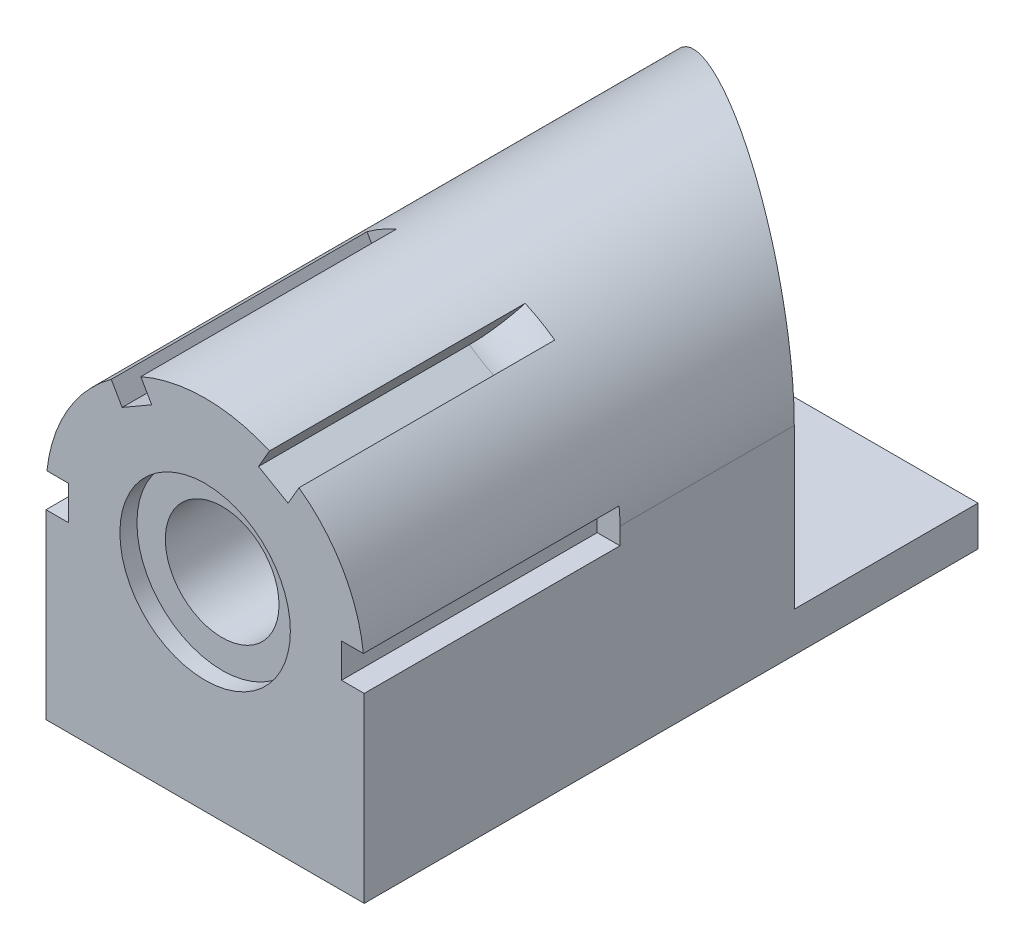
ISO-10303-21;
HEADER;
FILE_DESCRIPTION(('STEP AP214'),'2;1');
FILE_NAME('part.step','',(''),(''),'','','');
FILE_SCHEMA(('AUTOMOTIVE_DESIGN { 1 0 10303 214 1 1 1 1 }'));
ENDSEC;
DATA;
#1=APPLICATION_CONTEXT('core data for automotive mechanical design processes');
#2=APPLICATION_PROTOCOL_DEFINITION('international standard','automotive_design',2000,#1);
#3=PRODUCT_CONTEXT('',#1,'mechanical');
#4=PRODUCT('Part','Part','',(#3));
#5=PRODUCT_RELATED_PRODUCT_CATEGORY('part','',(#4));
#6=PRODUCT_DEFINITION_FORMATION('','',#4);
#7=PRODUCT_DEFINITION_CONTEXT('part definition',#1,'design');
#8=PRODUCT_DEFINITION('design','',#6,#7);
#9=PRODUCT_DEFINITION_SHAPE('','',#8);
#10=(LENGTH_UNIT() NAMED_UNIT(*) SI_UNIT(.MILLI.,.METRE.));
#11=(NAMED_UNIT(*) PLANE_ANGLE_UNIT() SI_UNIT($,.RADIAN.));
#12=(NAMED_UNIT(*) SI_UNIT($,.STERADIAN.) SOLID_ANGLE_UNIT());
#13=UNCERTAINTY_MEASURE_WITH_UNIT(LENGTH_MEASURE(1.E-05),#10,'distance_accuracy_value','');
#14=(GEOMETRIC_REPRESENTATION_CONTEXT(3) GLOBAL_UNCERTAINTY_ASSIGNED_CONTEXT((#13)) GLOBAL_UNIT_ASSIGNED_CONTEXT((#10,
#11,#12)) REPRESENTATION_CONTEXT('',''));
#15=CARTESIAN_POINT('',(0.,0.,0.));
#16=DIRECTION('',(0.,0.,1.));
#17=DIRECTION('',(1.,0.,0.));
#18=AXIS2_PLACEMENT_3D('',#15,#16,#17);
#19=CARTESIAN_POINT('',(0.,35.,-108.));
#20=DIRECTION('',(0.,0.,1.));
#21=DIRECTION('',(1.,0.,0.));
#22=AXIS2_PLACEMENT_3D('',#19,#20,#21);
#23=CYLINDRICAL_SURFACE('',#22,10.);
#24=CARTESIAN_POINT('',(0.,35.,-91.8341924626907));
#25=DIRECTION('',(0.499999999999995,0.,-0.866025403784442));
#26=DIRECTION('',(0.866025403784442,0.,0.499999999999995));
#27=AXIS2_PLACEMENT_3D('',#24,#25,#26);
#28=ELLIPSE('',#27,11.5470053837925,10.);
#29=CARTESIAN_POINT('',(10.,35.,-86.0606897707945));
#30=VERTEX_POINT('',#29);
#31=EDGE_CURVE('E351',#30,#30,#28,.F.);
#32=ORIENTED_EDGE('',*,*,#31,.F.);
#33=EDGE_LOOP('',(#32));
#34=FACE_BOUND('',#33,.T.);
#35=CARTESIAN_POINT('',(0.,35.,-3.));
#36=DIRECTION('',(0.,0.,1.));
#37=DIRECTION('',(1.,0.,0.));
#38=AXIS2_PLACEMENT_3D('',#35,#36,#37);
#39=CIRCLE('',#38,10.);
#40=CARTESIAN_POINT('',(10.,35.,-3.));
#41=VERTEX_POINT('',#40);
#42=EDGE_CURVE('E325',#41,#41,#39,.T.);
#43=ORIENTED_EDGE('',*,*,#42,.T.);
#44=EDGE_LOOP('',(#43));
#45=FACE_BOUND('',#44,.T.);
#46=ADVANCED_FACE('F41',(#34,#45),#23,.F.);
#47=CARTESIAN_POINT('',(28.,35.,-108.));
#48=DIRECTION('',(1.,0.,0.));
#49=DIRECTION('',(0.,1.,0.));
#50=AXIS2_PLACEMENT_3D('',#47,#48,#49);
#51=PLANE('',#50);
#52=DIRECTION('',(0.,0.,-1.));
#53=VECTOR('',#52,1.);
#54=CARTESIAN_POINT('',(28.,32.,-108.));
#55=LINE('',#54,#53);
#56=CARTESIAN_POINT('',(28.,32.,0.));
#57=VERTEX_POINT('',#56);
#58=CARTESIAN_POINT('',(28.,32.,-45.));
#59=VERTEX_POINT('',#58);
#60=EDGE_CURVE('E230',#57,#59,#55,.T.);
#61=ORIENTED_EDGE('',*,*,#60,.F.);
#62=DIRECTION('',(0.,1.,0.));
#63=VECTOR('',#62,1.);
#64=CARTESIAN_POINT('',(28.,35.,0.));
#65=LINE('',#64,#63);
#66=CARTESIAN_POINT('',(28.,0.,0.));
#67=VERTEX_POINT('',#66);
#68=EDGE_CURVE('E355',#67,#57,#65,.T.);
#69=ORIENTED_EDGE('',*,*,#68,.F.);
#70=DIRECTION('',(0.,0.,1.));
#71=VECTOR('',#70,1.);
#72=CARTESIAN_POINT('',(28.,0.,-108.));
#73=LINE('',#72,#71);
#74=CARTESIAN_POINT('',(28.,0.,-108.));
#75=VERTEX_POINT('',#74);
#76=EDGE_CURVE('E385',#75,#67,#73,.T.);
#77=ORIENTED_EDGE('',*,*,#76,.F.);
#78=DIRECTION('',(0.,1.,0.));
#79=VECTOR('',#78,1.);
#80=CARTESIAN_POINT('',(28.,35.,-108.));
#81=LINE('',#80,#79);
#82=CARTESIAN_POINT('',(28.,7.,-108.));
#83=VERTEX_POINT('',#82);
#84=EDGE_CURVE('E356',#75,#83,#81,.T.);
#85=ORIENTED_EDGE('',*,*,#84,.T.);
#86=DIRECTION('',(0.,0.,-1.));
#87=VECTOR('',#86,1.);
#88=CARTESIAN_POINT('',(28.,7.,-108.));
#89=LINE('',#88,#87);
#90=CARTESIAN_POINT('',(28.,7.,-75.6683849253814));
#91=VERTEX_POINT('',#90);
#92=EDGE_CURVE('E345',#91,#83,#89,.T.);
#93=ORIENTED_EDGE('',*,*,#92,.F.);
#94=DIRECTION('',(0.,-1.,0.));
#95=VECTOR('',#94,1.);
#96=CARTESIAN_POINT('',(28.,63.,-75.6683849253814));
#97=LINE('',#96,#95);
#98=CARTESIAN_POINT('',(28.,35.,-75.6683849253814));
#99=VERTEX_POINT('',#98);
#100=EDGE_CURVE('E348',#99,#91,#97,.T.);
#101=ORIENTED_EDGE('',*,*,#100,.F.);
#102=DIRECTION('',(0.,0.,1.));
#103=VECTOR('',#102,1.);
#104=CARTESIAN_POINT('',(28.,35.,-108.));
#105=LINE('',#104,#103);
#106=CARTESIAN_POINT('',(28.,35.,-45.));
#107=VERTEX_POINT('',#106);
#108=EDGE_CURVE('E370',#99,#107,#105,.T.);
#109=ORIENTED_EDGE('',*,*,#108,.T.);
#110=DIRECTION('',(0.,-1.,0.));
#111=VECTOR('',#110,1.);
#112=CARTESIAN_POINT('',(28.,35.,-45.));
#113=LINE('',#112,#111);
#114=EDGE_CURVE('E285',#107,#59,#113,.T.);
#115=ORIENTED_EDGE('',*,*,#114,.T.);
#116=EDGE_LOOP('',(#61,#69,#77,#85,#93,#101,#109,#115));
#117=FACE_BOUND('',#116,.T.);
#118=ADVANCED_FACE('F510',(#117),#51,.T.);
#119=CARTESIAN_POINT('',(0.,35.,-108.));
#120=DIRECTION('',(0.,0.,1.));
#121=DIRECTION('',(1.,0.,0.));
#122=AXIS2_PLACEMENT_3D('',#119,#120,#121);
#123=CYLINDRICAL_SURFACE('',#122,28.);
#124=DIRECTION('',(0.,0.,1.));
#125=VECTOR('',#124,1.);
#126=CARTESIAN_POINT('',(-16.5174871184283,57.6091269024824,-108.));
#127=LINE('',#126,#125);
#128=CARTESIAN_POINT('',(-16.5174871184283,57.6091269024824,-45.));
#129=VERTEX_POINT('',#128);
#130=CARTESIAN_POINT('',(-16.5174871184283,57.6091269024824,0.));
#131=VERTEX_POINT('',#130);
#132=EDGE_CURVE('E282',#129,#131,#127,.T.);
#133=ORIENTED_EDGE('',*,*,#132,.F.);
#134=CARTESIAN_POINT('',(0.,35.,-45.));
#135=DIRECTION('',(0.,0.,1.));
#136=DIRECTION('',(1.,0.,0.));
#137=AXIS2_PLACEMENT_3D('',#134,#135,#136);
#138=CIRCLE('',#137,28.);
#139=CARTESIAN_POINT('',(-11.3213346957217,60.6091269024824,-45.));
#140=VERTEX_POINT('',#139);
#141=EDGE_CURVE('E427',#129,#140,#138,.F.);
#142=ORIENTED_EDGE('',*,*,#141,.T.);
#143=DIRECTION('',(0.,0.,1.));
#144=VECTOR('',#143,1.);
#145=CARTESIAN_POINT('',(-11.3213346957217,60.6091269024824,-108.));
#146=LINE('',#145,#144);
#147=CARTESIAN_POINT('',(-11.3213346957217,60.6091269024824,0.));
#148=VERTEX_POINT('',#147);
#149=EDGE_CURVE('E210',#148,#140,#146,.F.);
#150=ORIENTED_EDGE('',*,*,#149,.F.);
#151=CARTESIAN_POINT('',(0.,35.,0.));
#152=DIRECTION('',(0.,0.,1.));
#153=DIRECTION('',(1.,0.,0.));
#154=AXIS2_PLACEMENT_3D('',#151,#152,#153);
#155=CIRCLE('',#154,28.);
#156=CARTESIAN_POINT('',(11.3213346957219,60.6091269024823,0.));
#157=VERTEX_POINT('',#156);
#158=EDGE_CURVE('E377',#157,#148,#155,.T.);
#159=ORIENTED_EDGE('',*,*,#158,.F.);
#160=DIRECTION('',(0.,0.,1.));
#161=VECTOR('',#160,1.);
#162=CARTESIAN_POINT('',(11.3213346957219,60.6091269024823,-108.));
#163=LINE('',#162,#161);
#164=CARTESIAN_POINT('',(11.3213346957219,60.6091269024823,-45.));
#165=VERTEX_POINT('',#164);
#166=EDGE_CURVE('E277',#165,#157,#163,.T.);
#167=ORIENTED_EDGE('',*,*,#166,.F.);
#168=CARTESIAN_POINT('',(0.,35.,-45.));
#169=DIRECTION('',(0.,0.,1.));
#170=DIRECTION('',(1.,0.,0.));
#171=AXIS2_PLACEMENT_3D('',#168,#169,#170);
#172=CIRCLE('',#171,28.);
#173=CARTESIAN_POINT('',(16.5174871184285,57.6091269024823,-45.));
#174=VERTEX_POINT('',#173);
#175=EDGE_CURVE('E423',#165,#174,#172,.F.);
#176=ORIENTED_EDGE('',*,*,#175,.T.);
#177=DIRECTION('',(0.,0.,1.));
#178=VECTOR('',#177,1.);
#179=CARTESIAN_POINT('',(16.5174871184285,57.6091269024823,-108.));
#180=LINE('',#179,#178);
#181=CARTESIAN_POINT('',(16.5174871184285,57.6091269024823,0.));
#182=VERTEX_POINT('',#181);
#183=EDGE_CURVE('E274',#182,#174,#180,.F.);
#184=ORIENTED_EDGE('',*,*,#183,.F.);
#185=CARTESIAN_POINT('',(27.8388218141501,38.,0.));
#186=VERTEX_POINT('',#185);
#187=EDGE_CURVE('E378',#186,#182,#155,.T.);
#188=ORIENTED_EDGE('',*,*,#187,.F.);
#189=DIRECTION('',(0.,0.,1.));
#190=VECTOR('',#189,1.);
#191=CARTESIAN_POINT('',(27.8388218141501,38.,-108.));
#192=LINE('',#191,#190);
#193=CARTESIAN_POINT('',(27.8388218141501,38.,-45.));
#194=VERTEX_POINT('',#193);
#195=EDGE_CURVE('E271',#194,#186,#192,.T.);
#196=ORIENTED_EDGE('',*,*,#195,.F.);
#197=CARTESIAN_POINT('',(0.,35.,-45.));
#198=DIRECTION('',(0.,0.,1.));
#199=DIRECTION('',(1.,0.,0.));
#200=AXIS2_PLACEMENT_3D('',#197,#198,#199);
#201=CIRCLE('',#200,28.);
#202=EDGE_CURVE('E419',#194,#107,#201,.F.);
#203=ORIENTED_EDGE('',*,*,#202,.T.);
#204=ORIENTED_EDGE('',*,*,#108,.F.);
#205=CARTESIAN_POINT('',(0.,35.,-91.8341924626907));
#206=DIRECTION('',(0.499999999999995,0.,-0.866025403784442));
#207=DIRECTION('',(0.866025403784442,0.,0.499999999999995));
#208=AXIS2_PLACEMENT_3D('',#205,#206,#207);
#209=ELLIPSE('',#208,32.3316150746189,28.);
#210=CARTESIAN_POINT('',(-28.,35.,-108.));
#211=VERTEX_POINT('',#210);
#212=EDGE_CURVE('E352',#99,#211,#209,.F.);
#213=ORIENTED_EDGE('',*,*,#212,.T.);
#214=DIRECTION('',(0.,0.,1.));
#215=VECTOR('',#214,1.);
#216=CARTESIAN_POINT('',(-28.,35.,-108.));
#217=LINE('',#216,#215);
#218=CARTESIAN_POINT('',(-28.,35.,-45.));
#219=VERTEX_POINT('',#218);
#220=EDGE_CURVE('E393',#211,#219,#217,.T.);
#221=ORIENTED_EDGE('',*,*,#220,.T.);
#222=CARTESIAN_POINT('',(0.,35.,-45.));
#223=DIRECTION('',(0.,0.,1.));
#224=DIRECTION('',(1.,0.,0.));
#225=AXIS2_PLACEMENT_3D('',#222,#223,#224);
#226=CIRCLE('',#225,28.);
#227=CARTESIAN_POINT('',(-27.8388218141501,38.,-45.));
#228=VERTEX_POINT('',#227);
#229=EDGE_CURVE('E321',#219,#228,#226,.F.);
#230=ORIENTED_EDGE('',*,*,#229,.T.);
#231=DIRECTION('',(0.,0.,1.));
#232=VECTOR('',#231,1.);
#233=CARTESIAN_POINT('',(-27.8388218141501,38.,-108.));
#234=LINE('',#233,#232);
#235=CARTESIAN_POINT('',(-27.8388218141501,38.,0.));
#236=VERTEX_POINT('',#235);
#237=EDGE_CURVE('E312',#236,#228,#234,.F.);
#238=ORIENTED_EDGE('',*,*,#237,.F.);
#239=EDGE_CURVE('E374',#131,#236,#155,.T.);
#240=ORIENTED_EDGE('',*,*,#239,.F.);
#241=EDGE_LOOP('',(#133,#142,#150,#159,#167,#176,#184,#188,#196,#203,#204,#213,#221,#230,#238,#240));
#242=FACE_BOUND('',#241,.T.);
#243=ADVANCED_FACE('F516',(#242),#123,.T.);
#244=CARTESIAN_POINT('',(0.,35.,-108.));
#245=DIRECTION('',(0.,0.,1.));
#246=DIRECTION('',(1.,0.,0.));
#247=AXIS2_PLACEMENT_3D('',#244,#245,#246);
#248=PLANE('',#247);
#249=DIRECTION('',(-1.,0.,0.));
#250=VECTOR('',#249,1.);
#251=CARTESIAN_POINT('',(28.,7.,-108.));
#252=LINE('',#251,#250);
#253=CARTESIAN_POINT('',(-28.,7.,-108.));
#254=VERTEX_POINT('',#253);
#255=EDGE_CURVE('E334',#83,#254,#252,.T.);
#256=ORIENTED_EDGE('',*,*,#255,.F.);
#257=ORIENTED_EDGE('',*,*,#84,.F.);
#258=DIRECTION('',(1.,0.,0.));
#259=VECTOR('',#258,1.);
#260=CARTESIAN_POINT('',(-28.,0.,-108.));
#261=LINE('',#260,#259);
#262=CARTESIAN_POINT('',(-28.,0.,-108.));
#263=VERTEX_POINT('',#262);
#264=EDGE_CURVE('E366',#263,#75,#261,.T.);
#265=ORIENTED_EDGE('',*,*,#264,.F.);
#266=DIRECTION('',(0.,-1.,0.));
#267=VECTOR('',#266,1.);
#268=CARTESIAN_POINT('',(-28.,35.,-108.));
#269=LINE('',#268,#267);
#270=EDGE_CURVE('E360',#254,#263,#269,.T.);
#271=ORIENTED_EDGE('',*,*,#270,.F.);
#272=EDGE_LOOP('',(#256,#257,#265,#271));
#273=FACE_BOUND('',#272,.T.);
#274=ADVANCED_FACE('F512',(#273),#248,.F.);
#275=CARTESIAN_POINT('',(-28.,0.,-108.));
#276=DIRECTION('',(0.,-1.,0.));
#277=DIRECTION('',(1.,0.,0.));
#278=AXIS2_PLACEMENT_3D('',#275,#276,#277);
#279=PLANE('',#278);
#280=DIRECTION('',(1.,0.,0.));
#281=VECTOR('',#280,1.);
#282=CARTESIAN_POINT('',(-28.,0.,0.));
#283=LINE('',#282,#281);
#284=CARTESIAN_POINT('',(-28.,0.,0.));
#285=VERTEX_POINT('',#284);
#286=EDGE_CURVE('E361',#285,#67,#283,.T.);
#287=ORIENTED_EDGE('',*,*,#286,.F.);
#288=DIRECTION('',(0.,0.,1.));
#289=VECTOR('',#288,1.);
#290=CARTESIAN_POINT('',(-28.,0.,-108.));
#291=LINE('',#290,#289);
#292=EDGE_CURVE('E389',#263,#285,#291,.T.);
#293=ORIENTED_EDGE('',*,*,#292,.F.);
#294=ORIENTED_EDGE('',*,*,#264,.T.);
#295=ORIENTED_EDGE('',*,*,#76,.T.);
#296=EDGE_LOOP('',(#287,#293,#294,#295));
#297=FACE_BOUND('',#296,.T.);
#298=ADVANCED_FACE('F515',(#297),#279,.T.);
#299=CARTESIAN_POINT('',(-28.,35.,-108.));
#300=DIRECTION('',(-1.,0.,0.));
#301=DIRECTION('',(0.,-1.,0.));
#302=AXIS2_PLACEMENT_3D('',#299,#300,#301);
#303=PLANE('',#302);
#304=DIRECTION('',(0.,0.,1.));
#305=VECTOR('',#304,1.);
#306=CARTESIAN_POINT('',(-28.,32.,-108.));
#307=LINE('',#306,#305);
#308=CARTESIAN_POINT('',(-28.,32.,-45.));
#309=VERTEX_POINT('',#308);
#310=CARTESIAN_POINT('',(-28.,32.,0.));
#311=VERTEX_POINT('',#310);
#312=EDGE_CURVE('E318',#309,#311,#307,.T.);
#313=ORIENTED_EDGE('',*,*,#312,.F.);
#314=DIRECTION('',(0.,1.,0.));
#315=VECTOR('',#314,1.);
#316=CARTESIAN_POINT('',(-28.,35.,-45.));
#317=LINE('',#316,#315);
#318=EDGE_CURVE('E405',#309,#219,#317,.T.);
#319=ORIENTED_EDGE('',*,*,#318,.T.);
#320=ORIENTED_EDGE('',*,*,#220,.F.);
#321=EDGE_CURVE('E362',#211,#254,#269,.T.);
#322=ORIENTED_EDGE('',*,*,#321,.T.);
#323=ORIENTED_EDGE('',*,*,#270,.T.);
#324=ORIENTED_EDGE('',*,*,#292,.T.);
#325=DIRECTION('',(0.,-1.,0.));
#326=VECTOR('',#325,1.);
#327=CARTESIAN_POINT('',(-28.,35.,0.));
#328=LINE('',#327,#326);
#329=EDGE_CURVE('E379',#311,#285,#328,.T.);
#330=ORIENTED_EDGE('',*,*,#329,.F.);
#331=EDGE_LOOP('',(#313,#319,#320,#322,#323,#324,#330));
#332=FACE_BOUND('',#331,.T.);
#333=ADVANCED_FACE('F520',(#332),#303,.T.);
#334=CARTESIAN_POINT('',(0.,35.,0.));
#335=DIRECTION('',(0.,0.,1.));
#336=DIRECTION('',(1.,0.,0.));
#337=AXIS2_PLACEMENT_3D('',#334,#335,#336);
#338=PLANE('',#337);
#339=DIRECTION('',(0.499999999999998,-0.86602540378444,0.));
#340=VECTOR('',#339,1.);
#341=CARTESIAN_POINT('',(-2.59807621135332,33.5,0.));
#342=LINE('',#341,#340);
#343=CARTESIAN_POINT('',(-14.5980762113533,54.2846096908266,0.));
#344=VERTEX_POINT('',#343);
#345=EDGE_CURVE('E416',#131,#344,#342,.T.);
#346=ORIENTED_EDGE('',*,*,#345,.F.);
#347=ORIENTED_EDGE('',*,*,#239,.T.);
#348=DIRECTION('',(-1.,0.,0.));
#349=VECTOR('',#348,1.);
#350=CARTESIAN_POINT('',(-28.7272999200964,38.,0.));
#351=LINE('',#350,#349);
#352=CARTESIAN_POINT('',(-24.,38.,0.));
#353=VERTEX_POINT('',#352);
#354=EDGE_CURVE('E295',#353,#236,#351,.T.);
#355=ORIENTED_EDGE('',*,*,#354,.F.);
#356=DIRECTION('',(0.,1.,0.));
#357=VECTOR('',#356,1.);
#358=CARTESIAN_POINT('',(-24.,38.,0.));
#359=LINE('',#358,#357);
#360=CARTESIAN_POINT('',(-24.,32.,0.));
#361=VERTEX_POINT('',#360);
#362=EDGE_CURVE('E289',#361,#353,#359,.T.);
#363=ORIENTED_EDGE('',*,*,#362,.F.);
#364=DIRECTION('',(1.,0.,0.));
#365=VECTOR('',#364,1.);
#366=CARTESIAN_POINT('',(0.,32.,0.));
#367=LINE('',#366,#365);
#368=EDGE_CURVE('E388',#311,#361,#367,.T.);
#369=ORIENTED_EDGE('',*,*,#368,.F.);
#370=ORIENTED_EDGE('',*,*,#329,.T.);
#371=ORIENTED_EDGE('',*,*,#286,.T.);
#372=ORIENTED_EDGE('',*,*,#68,.T.);
#373=DIRECTION('',(1.,0.,0.));
#374=VECTOR('',#373,1.);
#375=CARTESIAN_POINT('',(28.7272999200964,32.,0.));
#376=LINE('',#375,#374);
#377=CARTESIAN_POINT('',(24.,32.,0.));
#378=VERTEX_POINT('',#377);
#379=EDGE_CURVE('E250',#378,#57,#376,.T.);
#380=ORIENTED_EDGE('',*,*,#379,.F.);
#381=DIRECTION('',(0.,-1.,0.));
#382=VECTOR('',#381,1.);
#383=CARTESIAN_POINT('',(24.,32.,0.));
#384=LINE('',#383,#382);
#385=CARTESIAN_POINT('',(24.,38.,0.));
#386=VERTEX_POINT('',#385);
#387=EDGE_CURVE('E258',#386,#378,#384,.T.);
#388=ORIENTED_EDGE('',*,*,#387,.F.);
#389=DIRECTION('',(-1.,0.,0.));
#390=VECTOR('',#389,1.);
#391=CARTESIAN_POINT('',(0.,38.,0.));
#392=LINE('',#391,#390);
#393=EDGE_CURVE('E409',#186,#386,#392,.T.);
#394=ORIENTED_EDGE('',*,*,#393,.F.);
#395=ORIENTED_EDGE('',*,*,#187,.T.);
#396=DIRECTION('',(0.500000000000004,0.866025403784436,0.));
#397=VECTOR('',#396,1.);
#398=CARTESIAN_POINT('',(16.9617261714016,58.3785715129381,0.));
#399=LINE('',#398,#397);
#400=CARTESIAN_POINT('',(14.5980762113534,54.2846096908265,0.));
#401=VERTEX_POINT('',#400);
#402=EDGE_CURVE('E236',#401,#182,#399,.T.);
#403=ORIENTED_EDGE('',*,*,#402,.F.);
#404=DIRECTION('',(0.866025403784436,-0.500000000000004,0.));
#405=VECTOR('',#404,1.);
#406=CARTESIAN_POINT('',(14.5980762113534,54.2846096908265,0.));
#407=LINE('',#406,#405);
#408=CARTESIAN_POINT('',(9.40192378864679,57.2846096908265,0.));
#409=VERTEX_POINT('',#408);
#410=EDGE_CURVE('E232',#409,#401,#407,.T.);
#411=ORIENTED_EDGE('',*,*,#410,.F.);
#412=DIRECTION('',(-0.500000000000004,-0.866025403784436,0.));
#413=VECTOR('',#412,1.);
#414=CARTESIAN_POINT('',(-2.5980762113533,36.5,0.));
#415=LINE('',#414,#413);
#416=EDGE_CURVE('E412',#157,#409,#415,.T.);
#417=ORIENTED_EDGE('',*,*,#416,.F.);
#418=ORIENTED_EDGE('',*,*,#158,.T.);
#419=DIRECTION('',(-0.499999999999998,0.86602540378444,0.));
#420=VECTOR('',#419,1.);
#421=CARTESIAN_POINT('',(-11.7655737486948,61.3785715129382,0.));
#422=LINE('',#421,#420);
#423=CARTESIAN_POINT('',(-9.40192378864663,57.2846096908265,0.));
#424=VERTEX_POINT('',#423);
#425=EDGE_CURVE('E219',#424,#148,#422,.T.);
#426=ORIENTED_EDGE('',*,*,#425,.F.);
#427=DIRECTION('',(0.86602540378444,0.499999999999998,0.));
#428=VECTOR('',#427,1.);
#429=CARTESIAN_POINT('',(-9.40192378864663,57.2846096908265,0.));
#430=LINE('',#429,#428);
#431=EDGE_CURVE('E199',#344,#424,#430,.T.);
#432=ORIENTED_EDGE('',*,*,#431,.F.);
#433=EDGE_LOOP('',(#346,#347,#355,#363,#369,#370,#371,#372,#380,#388,#394,#395,#403,#411,#417,
#418,#426,#432));
#434=FACE_BOUND('',#433,.T.);
#435=CARTESIAN_POINT('',(0.,35.,0.));
#436=DIRECTION('',(0.,0.,1.));
#437=DIRECTION('',(1.,0.,0.));
#438=AXIS2_PLACEMENT_3D('',#435,#436,#437);
#439=CIRCLE('',#438,15.);
#440=CARTESIAN_POINT('',(15.,35.,0.));
#441=VERTEX_POINT('',#440);
#442=EDGE_CURVE('E329',#441,#441,#439,.T.);
#443=ORIENTED_EDGE('',*,*,#442,.F.);
#444=EDGE_LOOP('',(#443));
#445=FACE_BOUND('',#444,.T.);
#446=ADVANCED_FACE('F506',(#434,#445),#338,.T.);
#447=CARTESIAN_POINT('',(-28.,63.,-108.));
#448=DIRECTION('',(0.499999999999995,0.,-0.866025403784442));
#449=DIRECTION('',(-0.866025403784442,0.,-0.499999999999995));
#450=AXIS2_PLACEMENT_3D('',#447,#448,#449);
#451=PLANE('',#450);
#452=ORIENTED_EDGE('',*,*,#100,.T.);
#453=DIRECTION('',(0.866025403784442,0.,0.499999999999995));
#454=VECTOR('',#453,1.);
#455=CARTESIAN_POINT('',(-28.,7.,-108.));
#456=LINE('',#455,#454);
#457=EDGE_CURVE('E341',#254,#91,#456,.T.);
#458=ORIENTED_EDGE('',*,*,#457,.F.);
#459=ORIENTED_EDGE('',*,*,#321,.F.);
#460=ORIENTED_EDGE('',*,*,#212,.F.);
#461=EDGE_LOOP('',(#452,#458,#459,#460));
#462=FACE_BOUND('',#461,.T.);
#463=ORIENTED_EDGE('',*,*,#31,.T.);
#464=EDGE_LOOP('',(#463));
#465=FACE_BOUND('',#464,.T.);
#466=ADVANCED_FACE('F502',(#462,#465),#451,.T.);
#467=CARTESIAN_POINT('',(0.,7.,0.));
#468=DIRECTION('',(0.,1.,0.));
#469=DIRECTION('',(0.,0.,1.));
#470=AXIS2_PLACEMENT_3D('',#467,#468,#469);
#471=PLANE('',#470);
#472=ORIENTED_EDGE('',*,*,#255,.T.);
#473=ORIENTED_EDGE('',*,*,#457,.T.);
#474=ORIENTED_EDGE('',*,*,#92,.T.);
#475=EDGE_LOOP('',(#472,#473,#474));
#476=FACE_BOUND('',#475,.T.);
#477=ADVANCED_FACE('F498',(#476),#471,.T.);
#478=CARTESIAN_POINT('',(0.,35.,-3.));
#479=DIRECTION('',(0.,0.,1.));
#480=DIRECTION('',(1.,0.,0.));
#481=AXIS2_PLACEMENT_3D('',#478,#479,#480);
#482=CYLINDRICAL_SURFACE('',#481,15.);
#483=CARTESIAN_POINT('',(0.,35.,-3.));
#484=DIRECTION('',(0.,0.,1.));
#485=DIRECTION('',(1.,0.,0.));
#486=AXIS2_PLACEMENT_3D('',#483,#484,#485);
#487=CIRCLE('',#486,15.);
#488=CARTESIAN_POINT('',(15.,35.,-3.));
#489=VERTEX_POINT('',#488);
#490=EDGE_CURVE('E330',#489,#489,#487,.T.);
#491=ORIENTED_EDGE('',*,*,#490,.F.);
#492=EDGE_LOOP('',(#491));
#493=FACE_BOUND('',#492,.T.);
#494=ORIENTED_EDGE('',*,*,#442,.T.);
#495=EDGE_LOOP('',(#494));
#496=FACE_BOUND('',#495,.T.);
#497=ADVANCED_FACE('F494',(#493,#496),#482,.F.);
#498=CARTESIAN_POINT('',(0.,35.,-3.));
#499=DIRECTION('',(0.,0.,1.));
#500=DIRECTION('',(1.,0.,0.));
#501=AXIS2_PLACEMENT_3D('',#498,#499,#500);
#502=PLANE('',#501);
#503=ORIENTED_EDGE('',*,*,#42,.F.);
#504=EDGE_LOOP('',(#503));
#505=FACE_BOUND('',#504,.T.);
#506=ORIENTED_EDGE('',*,*,#490,.T.);
#507=EDGE_LOOP('',(#506));
#508=FACE_BOUND('',#507,.T.);
#509=ADVANCED_FACE('F490',(#505,#508),#502,.T.);
#510=CARTESIAN_POINT('',(-24.,38.,-45.));
#511=DIRECTION('',(1.,0.,0.));
#512=DIRECTION('',(0.,0.,-1.));
#513=AXIS2_PLACEMENT_3D('',#510,#511,#512);
#514=PLANE('',#513);
#515=ORIENTED_EDGE('',*,*,#362,.T.);
#516=DIRECTION('',(0.,0.,1.));
#517=VECTOR('',#516,1.);
#518=CARTESIAN_POINT('',(-24.,38.,-45.));
#519=LINE('',#518,#517);
#520=CARTESIAN_POINT('',(-24.,38.,-45.));
#521=VERTEX_POINT('',#520);
#522=EDGE_CURVE('E302',#521,#353,#519,.T.);
#523=ORIENTED_EDGE('',*,*,#522,.F.);
#524=DIRECTION('',(0.,1.,0.));
#525=VECTOR('',#524,1.);
#526=CARTESIAN_POINT('',(-24.,38.,-45.));
#527=LINE('',#526,#525);
#528=CARTESIAN_POINT('',(-24.,32.,-45.));
#529=VERTEX_POINT('',#528);
#530=EDGE_CURVE('E290',#529,#521,#527,.T.);
#531=ORIENTED_EDGE('',*,*,#530,.F.);
#532=DIRECTION('',(0.,0.,1.));
#533=VECTOR('',#532,1.);
#534=CARTESIAN_POINT('',(-24.,32.,-45.));
#535=LINE('',#534,#533);
#536=EDGE_CURVE('E308',#529,#361,#535,.T.);
#537=ORIENTED_EDGE('',*,*,#536,.T.);
#538=EDGE_LOOP('',(#515,#523,#531,#537));
#539=FACE_BOUND('',#538,.T.);
#540=ADVANCED_FACE('F483',(#539),#514,.F.);
#541=CARTESIAN_POINT('',(-28.7272999200964,32.,-45.));
#542=DIRECTION('',(0.,-1.,0.));
#543=DIRECTION('',(0.,0.,-1.));
#544=AXIS2_PLACEMENT_3D('',#541,#542,#543);
#545=PLANE('',#544);
#546=ORIENTED_EDGE('',*,*,#312,.T.);
#547=ORIENTED_EDGE('',*,*,#368,.T.);
#548=ORIENTED_EDGE('',*,*,#536,.F.);
#549=DIRECTION('',(1.,0.,0.));
#550=VECTOR('',#549,1.);
#551=CARTESIAN_POINT('',(-28.7272999200964,32.,-45.));
#552=LINE('',#551,#550);
#553=EDGE_CURVE('E299',#309,#529,#552,.T.);
#554=ORIENTED_EDGE('',*,*,#553,.F.);
#555=EDGE_LOOP('',(#546,#547,#548,#554));
#556=FACE_BOUND('',#555,.T.);
#557=ADVANCED_FACE('F480',(#556),#545,.F.);
#558=CARTESIAN_POINT('',(-28.7272999200964,38.,-45.));
#559=DIRECTION('',(0.,1.,0.));
#560=DIRECTION('',(0.,0.,1.));
#561=AXIS2_PLACEMENT_3D('',#558,#559,#560);
#562=PLANE('',#561);
#563=ORIENTED_EDGE('',*,*,#237,.T.);
#564=DIRECTION('',(-1.,0.,0.));
#565=VECTOR('',#564,1.);
#566=CARTESIAN_POINT('',(-28.7272999200964,38.,-45.));
#567=LINE('',#566,#565);
#568=EDGE_CURVE('E294',#521,#228,#567,.T.);
#569=ORIENTED_EDGE('',*,*,#568,.F.);
#570=ORIENTED_EDGE('',*,*,#522,.T.);
#571=ORIENTED_EDGE('',*,*,#354,.T.);
#572=EDGE_LOOP('',(#563,#569,#570,#571));
#573=FACE_BOUND('',#572,.T.);
#574=ADVANCED_FACE('F478',(#573),#562,.F.);
#575=CARTESIAN_POINT('',(0.,0.,-45.));
#576=DIRECTION('',(0.,0.,1.));
#577=DIRECTION('',(1.,0.,0.));
#578=AXIS2_PLACEMENT_3D('',#575,#576,#577);
#579=PLANE('',#578);
#580=ORIENTED_EDGE('',*,*,#318,.F.);
#581=ORIENTED_EDGE('',*,*,#553,.T.);
#582=ORIENTED_EDGE('',*,*,#530,.T.);
#583=ORIENTED_EDGE('',*,*,#568,.T.);
#584=ORIENTED_EDGE('',*,*,#229,.F.);
#585=EDGE_LOOP('',(#580,#581,#582,#583,#584));
#586=FACE_BOUND('',#585,.T.);
#587=ADVANCED_FACE('F474',(#586),#579,.T.);
#588=CARTESIAN_POINT('',(24.,32.,-45.));
#589=DIRECTION('',(-1.,0.,0.));
#590=DIRECTION('',(0.,0.,1.));
#591=AXIS2_PLACEMENT_3D('',#588,#589,#590);
#592=PLANE('',#591);
#593=ORIENTED_EDGE('',*,*,#387,.T.);
#594=DIRECTION('',(0.,0.,1.));
#595=VECTOR('',#594,1.);
#596=CARTESIAN_POINT('',(24.,32.,-45.));
#597=LINE('',#596,#595);
#598=CARTESIAN_POINT('',(24.,32.,-45.));
#599=VERTEX_POINT('',#598);
#600=EDGE_CURVE('E257',#599,#378,#597,.T.);
#601=ORIENTED_EDGE('',*,*,#600,.F.);
#602=DIRECTION('',(0.,-1.,0.));
#603=VECTOR('',#602,1.);
#604=CARTESIAN_POINT('',(24.,32.,-45.));
#605=LINE('',#604,#603);
#606=CARTESIAN_POINT('',(24.,38.,-45.));
#607=VERTEX_POINT('',#606);
#608=EDGE_CURVE('E245',#607,#599,#605,.T.);
#609=ORIENTED_EDGE('',*,*,#608,.F.);
#610=DIRECTION('',(0.,0.,1.));
#611=VECTOR('',#610,1.);
#612=CARTESIAN_POINT('',(24.,38.,-45.));
#613=LINE('',#612,#611);
#614=EDGE_CURVE('E237',#607,#386,#613,.T.);
#615=ORIENTED_EDGE('',*,*,#614,.T.);
#616=EDGE_LOOP('',(#593,#601,#609,#615));
#617=FACE_BOUND('',#616,.T.);
#618=ADVANCED_FACE('F467',(#617),#592,.F.);
#619=CARTESIAN_POINT('',(28.7272999200964,38.,-45.));
#620=DIRECTION('',(0.,1.,0.));
#621=DIRECTION('',(0.,0.,1.));
#622=AXIS2_PLACEMENT_3D('',#619,#620,#621);
#623=PLANE('',#622);
#624=ORIENTED_EDGE('',*,*,#195,.T.);
#625=ORIENTED_EDGE('',*,*,#393,.T.);
#626=ORIENTED_EDGE('',*,*,#614,.F.);
#627=DIRECTION('',(-1.,0.,0.));
#628=VECTOR('',#627,1.);
#629=CARTESIAN_POINT('',(28.7272999200964,38.,-45.));
#630=LINE('',#629,#628);
#631=EDGE_CURVE('E254',#194,#607,#630,.T.);
#632=ORIENTED_EDGE('',*,*,#631,.F.);
#633=EDGE_LOOP('',(#624,#625,#626,#632));
#634=FACE_BOUND('',#633,.T.);
#635=ADVANCED_FACE('F464',(#634),#623,.F.);
#636=CARTESIAN_POINT('',(28.7272999200964,32.,-45.));
#637=DIRECTION('',(0.,-1.,0.));
#638=DIRECTION('',(0.,0.,-1.));
#639=AXIS2_PLACEMENT_3D('',#636,#637,#638);
#640=PLANE('',#639);
#641=ORIENTED_EDGE('',*,*,#60,.T.);
#642=DIRECTION('',(1.,0.,0.));
#643=VECTOR('',#642,1.);
#644=CARTESIAN_POINT('',(28.7272999200964,32.,-45.));
#645=LINE('',#644,#643);
#646=EDGE_CURVE('E249',#599,#59,#645,.T.);
#647=ORIENTED_EDGE('',*,*,#646,.F.);
#648=ORIENTED_EDGE('',*,*,#600,.T.);
#649=ORIENTED_EDGE('',*,*,#379,.T.);
#650=EDGE_LOOP('',(#641,#647,#648,#649));
#651=FACE_BOUND('',#650,.T.);
#652=ADVANCED_FACE('F462',(#651),#640,.F.);
#653=CARTESIAN_POINT('',(0.,70.,-45.));
#654=DIRECTION('',(0.,0.,1.));
#655=DIRECTION('',(-1.,0.,0.));
#656=AXIS2_PLACEMENT_3D('',#653,#654,#655);
#657=PLANE('',#656);
#658=ORIENTED_EDGE('',*,*,#202,.F.);
#659=ORIENTED_EDGE('',*,*,#631,.T.);
#660=ORIENTED_EDGE('',*,*,#608,.T.);
#661=ORIENTED_EDGE('',*,*,#646,.T.);
#662=ORIENTED_EDGE('',*,*,#114,.F.);
#663=EDGE_LOOP('',(#658,#659,#660,#661,#662));
#664=FACE_BOUND('',#663,.T.);
#665=ADVANCED_FACE('F458',(#664),#657,.T.);
#666=CARTESIAN_POINT('',(14.5980762113534,54.2846096908265,-45.));
#667=DIRECTION('',(-0.500000000000004,-0.866025403784436,0.));
#668=DIRECTION('',(0.866025403784436,-0.500000000000004,0.));
#669=AXIS2_PLACEMENT_3D('',#666,#667,#668);
#670=PLANE('',#669);
#671=DIRECTION('',(0.,0.,1.));
#672=VECTOR('',#671,1.);
#673=CARTESIAN_POINT('',(14.5980762113534,54.2846096908265,-45.));
#674=LINE('',#673,#672);
#675=CARTESIAN_POINT('',(14.5980762113534,54.2846096908265,-37.1007978518009));
#676=VERTEX_POINT('',#675);
#677=EDGE_CURVE('E240',#676,#401,#674,.T.);
#678=ORIENTED_EDGE('',*,*,#677,.F.);
#679=CARTESIAN_POINT('',(18.4873032086477,52.039163436999,-37.6822100282968));
#680=CARTESIAN_POINT('',(17.7248383706243,52.4793727164794,-42.0757500523806));
#681=CARTESIAN_POINT('',(18.8894601998605,55.6685338947368,-45.));
#682=CARTESIAN_POINT('',(18.2191308689501,52.1939928095127,-37.6201887538816));
#683=CARTESIAN_POINT('',(17.4914126140737,52.6141411398597,-42.0647629717188));
#684=CARTESIAN_POINT('',(18.7099488311003,55.8326088925972,-45.));
#685=CARTESIAN_POINT('',(17.9500992496783,52.3493182873197,-37.563274883484));
#686=CARTESIAN_POINT('',(17.2570418504643,52.7494551633198,-42.0556083255458));
#687=CARTESIAN_POINT('',(18.5266639608055,55.9958100086446,-45.));
#688=CARTESIAN_POINT('',(17.41071192567,52.6607337040334,-37.458860672685));
#689=CARTESIAN_POINT('',(16.785935895283,53.0214483133605,-42.0401884328266));
#690=CARTESIAN_POINT('',(18.1529828537854,56.3197132613644,-45.));
#691=CARTESIAN_POINT('',(17.1403564502087,52.8168235105678,-37.4113587574925));
#692=CARTESIAN_POINT('',(16.5492730135314,53.1580856918471,-42.0339334942226));
#693=CARTESIAN_POINT('',(17.9625878130674,56.4804158119386,-45.));
#694=CARTESIAN_POINT('',(16.5989221390976,53.1294207558363,-37.3249942129953));
#695=CARTESIAN_POINT('',(16.0742028176633,53.4323675973154,-42.0235838795964));
#696=CARTESIAN_POINT('',(17.5752735679765,56.7984521083537,-45.));
#697=CARTESIAN_POINT('',(16.3278444182539,53.2859275509368,-37.2861221899495));
#698=CARTESIAN_POINT('',(15.8358788296573,53.5699640159451,-42.0194941054646));
#699=CARTESIAN_POINT('',(17.3783617282715,56.9557893470545,-45.));
#700=CARTESIAN_POINT('',(15.7849162068523,53.5993872999402,-37.2163295884101));
#701=CARTESIAN_POINT('',(15.3575590538251,53.8461220672805,-42.0128813085108));
#702=CARTESIAN_POINT('',(16.9782518049545,57.2666382947211,-45.));
#703=CARTESIAN_POINT('',(15.5130656780423,53.7563402759279,-37.1854094106931));
#704=CARTESIAN_POINT('',(15.1176532248412,53.9846317622245,-42.0103629968655));
#705=CARTESIAN_POINT('',(16.775053405075,57.4201498105167,-45.));
#706=CARTESIAN_POINT('',(14.7023333042336,54.2244168301871,-37.1043467443448));
#707=CARTESIAN_POINT('',(14.4003207934481,54.3987838345878,-42.004423671688));
#708=CARTESIAN_POINT('',(16.16100437431,57.8708919442277,-45.));
#709=CARTESIAN_POINT('',(14.1626221219181,54.5360192265817,-37.0650272637486));
#710=CARTESIAN_POINT('',(13.9221048863406,54.674881917287,-42.0025580078332));
#711=CARTESIAN_POINT('',(15.7416457385721,58.1616672155966,-45.));
#712=CARTESIAN_POINT('',(13.0819348062247,55.1599543392071,-37.0128414417155));
#713=CARTESIAN_POINT('',(12.9621769051384,55.2290965956368,-42.0003390812742));
#714=CARTESIAN_POINT('',(14.8838954703975,58.7219783954621,-45.));
#715=CARTESIAN_POINT('',(12.5409580883922,55.472287392873,-36.9999918607292));
#716=CARTESIAN_POINT('',(12.4812937916954,55.5067345906319,-41.9999913752612));
#717=CARTESIAN_POINT('',(14.4454919582049,58.9915007430469,-45.));
#718=CARTESIAN_POINT('',(11.6373065840227,55.9940108321743,-37.000005457095));
#719=CARTESIAN_POINT('',(11.6773092988178,55.9709152540191,-42.0000057825863));
#720=CARTESIAN_POINT('',(13.7013132743913,59.4211619628501,-45.));
#721=CARTESIAN_POINT('',(11.2746215424109,56.2034071385799,-37.0057907576853));
#722=CARTESIAN_POINT('',(11.354754942781,56.1571420983052,-42.0001717776181));
#723=CARTESIAN_POINT('',(13.3994401278818,59.5880781869509,-45.));
#724=CARTESIAN_POINT('',(10.5495264687975,56.6220409745187,-37.0291139841933));
#725=CARTESIAN_POINT('',(10.7101092580558,56.5293284579132,-42.001024560048));
#726=CARTESIAN_POINT('',(12.7908110813644,59.9101110889837,-45.));
#727=CARTESIAN_POINT('',(10.1871164376854,56.8312785035383,-37.0466519479634));
#728=CARTESIAN_POINT('',(10.3882718007924,56.7151414004996,-42.0017105998945));
#729=CARTESIAN_POINT('',(12.4840551656334,60.0652277289104,-45.));
#730=CARTESIAN_POINT('',(9.46314521174372,57.2492634857213,-37.0939683611294));
#731=CARTESIAN_POINT('',(9.74602760813432,57.0859412580162,-42.0041183827827));
#732=CARTESIAN_POINT('',(11.8674709180243,60.3629705081315,-45.));
#733=CARTESIAN_POINT('',(9.10158360086002,57.4580111790936,-37.1237382533265));
#734=CARTESIAN_POINT('',(9.4258637120519,57.2707879696042,-42.0058368606948));
#735=CARTESIAN_POINT('',(11.5576448815141,60.5056052950207,-45.));
#736=CARTESIAN_POINT('',(8.37945148275755,57.8749343518706,-37.1963814927705));
#737=CARTESIAN_POINT('',(8.78750966122967,57.6393418526847,-42.0111751443036));
#738=CARTESIAN_POINT('',(10.9363943427577,60.7780977633307,-45.));
#739=CARTESIAN_POINT('',(8.01888094332308,58.0831098498749,-37.239254408885));
#740=CARTESIAN_POINT('',(8.46954606790911,57.8229182188808,-42.0147885772574));
#741=CARTESIAN_POINT('',(10.6249698934359,60.9079558649604,-45.));
#742=CARTESIAN_POINT('',(7.29408777626515,58.5015693799826,-37.3400545851047));
#743=CARTESIAN_POINT('',(7.83188073003454,58.1910744733556,-42.0251906885449));
#744=CARTESIAN_POINT('',(9.99783332573056,61.1564274500137,-45.));
#745=CARTESIAN_POINT('',(6.92988637353259,58.7118411578895,-37.3981877655744));
#746=CARTESIAN_POINT('',(7.51241645624492,58.3755172578245,-42.0320109324886));
#747=CARTESIAN_POINT('',(9.68212338048721,61.2748542182678,-45.));
#748=CARTESIAN_POINT('',(6.20379971096132,59.13104748798,-37.5309119440603));
#749=CARTESIAN_POINT('',(6.87732072759753,58.7421899477202,-42.0504451837553));
#750=CARTESIAN_POINT('',(9.05287694500619,61.4982427422551,-45.));
#751=CARTESIAN_POINT('',(5.84191398507769,59.3399823092348,-37.6054995160004));
#752=CARTESIAN_POINT('',(6.56187183220327,58.9243144523917,-42.0620349007277));
#753=CARTESIAN_POINT('',(8.73934001630725,61.60320729386,-45.));
#754=CARTESIAN_POINT('',(5.12053178028043,59.7564725193631,-37.7735353857591));
#755=CARTESIAN_POINT('',(5.93508165935223,59.2861919274126,-42.0919994770555));
#756=CARTESIAN_POINT('',(8.11573102078917,61.8000377453428,-45.));
#757=CARTESIAN_POINT('',(4.76104255481806,59.9640237204546,-37.867025952637));
#758=CARTESIAN_POINT('',(5.62389719581766,59.465854361202,-42.1103530263099));
#759=CARTESIAN_POINT('',(7.80566839251129,61.8918734879915,-45.));
#760=CARTESIAN_POINT('',(4.22522987460572,60.2733753156104,-38.0234372133555));
#761=CARTESIAN_POINT('',(5.16116213000991,59.7330145760096,-42.1447767140154));
#762=CARTESIAN_POINT('',(7.34539208234471,62.0198192187377,-45.));
#763=CARTESIAN_POINT('',(4.04712967192556,60.3762015155705,-38.0782938191643));
#764=CARTESIAN_POINT('',(5.00782647571599,59.8215429572925,-42.1573760683047));
#765=CARTESIAN_POINT('',(7.19271321414805,62.0608466968824,-45.));
#766=CARTESIAN_POINT('',(3.69232536070176,60.5810478801652,-38.1938278444919));
#767=CARTESIAN_POINT('',(4.70292350193172,59.9975787712836,-42.185195277231));
#768=CARTESIAN_POINT('',(6.88929302998474,62.1396800546733,-45.));
#769=CARTESIAN_POINT('',(3.51562145650755,60.6830679268186,-38.2545060995414));
#770=CARTESIAN_POINT('',(4.55136686773616,60.0850800348339,-42.2004077488752));
#771=CARTESIAN_POINT('',(6.73855199566968,62.1774854704103,-45.));
#772=CARTESIAN_POINT('',(3.33974596215574,60.7846096908265,-38.3183043748636));
#773=CARTESIAN_POINT('',(4.40061020302181,60.1721194357888,-42.2171180488799));
#774=CARTESIAN_POINT('',(6.58894729125892,62.2137056203857,-45.));
#775=(BOUNDED_SURFACE() B_SPLINE_SURFACE(3,2,((#679,#680,#681),(#682,#683,#684),(#685,#686,
#687),(#688,#689,#690),(#691,#692,#693),(#694,#695,#696),(#697,#698,#699),(#700,#701,#702),
(#703,#704,#705),(#706,#707,#708),(#709,#710,#711),(#712,#713,#714),(#715,#716,#717),(#718,#719,
#720),(#721,#722,#723),(#724,#725,#726),(#727,#728,#729),(#730,#731,#732),(#733,#734,#735),
(#736,#737,#738),(#739,#740,#741),(#742,#743,#744),(#745,#746,#747),(#748,#749,#750),(#751,#752,
#753),(#754,#755,#756),(#757,#758,#759),(#760,#761,#762),(#763,#764,#765),(#766,#767,#768),
(#769,#770,#771),(#772,#773,#774)),.UNSPECIFIED.,.F.,.F.,.F.) B_SPLINE_SURFACE_WITH_KNOTS((4,2,
2,2,2,2,2,2,2,2,2,2,2,2,2,4),(3,3),(0.,0.947339144273261,1.89451964739801,2.84066402224195,
3.78685607384227,5.65951861509626,7.53336654175226,8.7897158230085,10.0460691506612,
11.3015450524826,12.5569796494729,13.8303134330652,15.1033823373545,16.3793300805871,
17.017783144291,17.6563279770792),(0.,1.),
.UNSPECIFIED.) GEOMETRIC_REPRESENTATION_ITEM() RATIONAL_B_SPLINE_SURFACE(((1.,0.912573133733617,
1.),(1.,0.911139348865063,1.),(1.,0.909774599083981,1.),(1.,0.907197015046425,1.),(1.,
0.905984155388492,1.),(1.,0.903724943981185,1.),(1.,0.902678411538837,1.),(1.,0.900761287438333,
1.),(1.,0.899890704648591,1.),(1.,0.897573750386838,1.),(1.,0.896398261182802,1.),(1.,
0.894824820212199,1.),(1.,0.89442736109368,1.),(1.,0.89442707695801,1.),(1.,0.894605553547998,
1.),(1.,0.895315814585064,1.),(1.,0.895847600170059,1.),(1.,0.89725407619664,1.),(1.,
0.89812852689719,1.),(1.,0.900203776629077,1.),(1.,0.901404564922692,1.),(1.,0.904129145913846,
1.),(1.,0.905657299715265,1.),(1.,0.908995758884618,1.),(1.,0.910806005493165,1.),(1.,
0.914677427266089,1.),(1.,0.91673916060775,1.),(1.,0.919985804212527,1.),(1.,0.92109413739096,
1.),(1.,0.923356019498123,1.),(1.,0.924509574903113,1.),(1.,0.925682611806153,1.))) REPRESENTATION_ITEM('') SURFACE());
#776=CARTESIAN_POINT('',(18.4873032086477,52.039163436999,-37.6822100282968));
#777=CARTESIAN_POINT('',(18.2191308689501,52.1939928095126,-37.6201887538816));
#778=CARTESIAN_POINT('',(17.9500992496783,52.3493182873197,-37.563274883484));
#779=CARTESIAN_POINT('',(17.41071192567,52.6607337040334,-37.458860672685));
#780=CARTESIAN_POINT('',(17.1403564502088,52.8168235105678,-37.4113587574925));
#781=CARTESIAN_POINT('',(16.5989221390976,53.1294207558363,-37.3249942129953));
#782=CARTESIAN_POINT('',(16.3278444182539,53.2859275509368,-37.2861221899495));
#783=CARTESIAN_POINT('',(15.7849162068523,53.5993872999402,-37.2163295884101));
#784=CARTESIAN_POINT('',(15.5130656780423,53.7563402759279,-37.1854094106931));
#785=CARTESIAN_POINT('',(14.7023333042336,54.2244168301871,-37.1043467443448));
#786=CARTESIAN_POINT('',(14.1626221219181,54.5360192265817,-37.0650272637486));
#787=CARTESIAN_POINT('',(13.0819348062247,55.1599543392071,-37.0128414417155));
#788=CARTESIAN_POINT('',(12.5409580883922,55.472287392873,-36.9999918607292));
#789=CARTESIAN_POINT('',(11.6373065840227,55.9940108321743,-37.000005457095));
#790=CARTESIAN_POINT('',(11.2746215424109,56.2034071385799,-37.0057907576853));
#791=CARTESIAN_POINT('',(10.5495264687975,56.6220409745187,-37.0291139841933));
#792=CARTESIAN_POINT('',(10.1871164376854,56.8312785035383,-37.0466519479634));
#793=CARTESIAN_POINT('',(9.46314521174372,57.2492634857213,-37.0939683611294));
#794=CARTESIAN_POINT('',(9.10158360086002,57.4580111790936,-37.1237382533265));
#795=CARTESIAN_POINT('',(8.37945148275755,57.8749343518706,-37.1963814927705));
#796=CARTESIAN_POINT('',(8.01888094332308,58.0831098498749,-37.239254408885));
#797=CARTESIAN_POINT('',(7.29408777626515,58.5015693799826,-37.3400545851047));
#798=CARTESIAN_POINT('',(6.92988637353259,58.7118411578895,-37.3981877655744));
#799=CARTESIAN_POINT('',(6.20379971096132,59.13104748798,-37.5309119440603));
#800=CARTESIAN_POINT('',(5.84191398507769,59.3399823092348,-37.6054995160004));
#801=CARTESIAN_POINT('',(5.12053178028043,59.7564725193631,-37.7735353857591));
#802=CARTESIAN_POINT('',(4.76104255481806,59.9640237204546,-37.867025952637));
#803=CARTESIAN_POINT('',(4.22522987460572,60.2733753156104,-38.0234372133555));
#804=CARTESIAN_POINT('',(4.04712967192556,60.3762015155705,-38.0782938191643));
#805=CARTESIAN_POINT('',(3.69232536070176,60.5810478801652,-38.1938278444919));
#806=CARTESIAN_POINT('',(3.51562145650755,60.6830679268186,-38.2545060995414));
#807=CARTESIAN_POINT('',(3.33974596215574,60.7846096908265,-38.3183043748636));
#808=B_SPLINE_CURVE_WITH_KNOTS('',3,(#776,#777,#778,#779,#780,#781,#782,#783,#784,#785,#786,
#787,#788,#789,#790,#791,#792,#793,#794,#795,#796,#797,#798,#799,#800,#801,#802,#803,#804,#805,
#806,#807),.UNSPECIFIED.,.F.,.F.,(4,2,2,2,2,2,2,2,2,2,2,2,2,2,2,4),(0.,0.947339144273261,
1.89451964739801,2.84066402224195,3.78685607384227,5.65951861509626,7.53336654175226,
8.7897158230085,10.0460691506612,11.3015450524826,12.5569796494729,13.8303134330652,
15.1033823373545,16.3793300805871,17.017783144291,17.6563279770792),.UNSPECIFIED.);
#809=CARTESIAN_POINT('',(9.40192378864679,57.2846096908265,-37.1007978518009));
#810=VERTEX_POINT('',#809);
#811=EDGE_CURVE('E55',#676,#810,#808,.T.);
#812=ORIENTED_EDGE('',*,*,#811,.T.);
#813=DIRECTION('',(0.,0.,1.));
#814=VECTOR('',#813,1.);
#815=CARTESIAN_POINT('',(9.40192378864679,57.2846096908265,-45.));
#816=LINE('',#815,#814);
#817=EDGE_CURVE('E227',#810,#409,#816,.T.);
#818=ORIENTED_EDGE('',*,*,#817,.T.);
#819=ORIENTED_EDGE('',*,*,#410,.T.);
#820=EDGE_LOOP('',(#678,#812,#818,#819));
#821=FACE_BOUND('',#820,.T.);
#822=ADVANCED_FACE('F454',(#821),#670,.F.);
#823=CARTESIAN_POINT('',(11.765573748695,61.3785715129381,-45.));
#824=DIRECTION('',(-0.866025403784436,0.500000000000004,0.));
#825=DIRECTION('',(-0.500000000000004,-0.866025403784436,0.));
#826=AXIS2_PLACEMENT_3D('',#823,#824,#825);
#827=PLANE('',#826);
#828=ORIENTED_EDGE('',*,*,#817,.F.);
#829=CARTESIAN_POINT('',(9.40192378864679,57.2846096908265,-37.1007978518009));
#830=CARTESIAN_POINT('',(9.40190525141893,57.284577583406,-37.3988189397544));
#831=CARTESIAN_POINT('',(9.40855344085697,57.296092585291,-37.6968343927999));
#832=CARTESIAN_POINT('',(9.43504599726212,57.3419790390071,-38.2905130699075));
#833=CARTESIAN_POINT('',(9.4548904648728,57.376350665158,-38.5861762760122));
#834=CARTESIAN_POINT('',(9.50761520290999,57.4676725902541,-39.1725480344543));
#835=CARTESIAN_POINT('',(9.54048404298122,57.5246030912434,-39.4632606987455));
#836=CARTESIAN_POINT('',(9.61898926396092,57.6605781226396,-40.0376834862514));
#837=CARTESIAN_POINT('',(9.66462452210676,57.7396207083648,-40.321394222875));
#838=CARTESIAN_POINT('',(9.76568944029244,57.9146702815251,-40.8655085154727));
#839=CARTESIAN_POINT('',(9.8205092919197,58.0096210498069,-41.1263659908261));
#840=CARTESIAN_POINT('',(9.94094856344283,58.2182279873116,-41.6379067488987));
#841=CARTESIAN_POINT('',(10.0065677892361,58.3318838203388,-41.8885902143796));
#842=CARTESIAN_POINT('',(10.1480749858395,58.5769814744925,-42.3777506744046));
#843=CARTESIAN_POINT('',(10.2239524161762,58.7084050389835,-42.616239856583));
#844=CARTESIAN_POINT('',(10.3854551860302,58.9881360419338,-43.0794951466716));
#845=CARTESIAN_POINT('',(10.4710779906762,59.1364390898671,-43.3042647999087));
#846=CARTESIAN_POINT('',(10.6744975780596,59.4887721504698,-43.7938957550213));
#847=CARTESIAN_POINT('',(10.794938216898,59.697381456234,-44.0544110491538));
#848=CARTESIAN_POINT('',(10.9853128466653,60.0271199874631,-44.4247579408381));
#849=CARTESIAN_POINT('',(11.0503741790101,60.1398095206924,-44.5447777096836));
#850=CARTESIAN_POINT('',(11.1835806243147,60.3705298518556,-44.7777536658254));
#851=CARTESIAN_POINT('',(11.2517256125866,60.4885604338237,-44.8907101382877));
#852=CARTESIAN_POINT('',(11.3213346957219,60.6091269024823,-45.));
#853=B_SPLINE_CURVE_WITH_KNOTS('',3,(#829,#830,#831,#832,#833,#834,#835,#836,#837,#838,#839,
#840,#841,#842,#843,#844,#845,#846,#847,#848,#849,#850,#851,#852),.UNSPECIFIED.,.F.,.F.,(4,2,2,
2,2,2,2,2,2,2,2,4),(0.,0.893759205437563,1.787525227353,2.68050859990271,3.57341346230837,
4.42130043131136,5.26917216247703,6.11617922070658,6.96296646508955,8.02515785670189,
8.55601332126987,9.08684733979669),.UNSPECIFIED.);
#854=EDGE_CURVE('E11',#810,#165,#853,.T.);
#855=ORIENTED_EDGE('',*,*,#854,.T.);
#856=ORIENTED_EDGE('',*,*,#166,.T.);
#857=ORIENTED_EDGE('',*,*,#416,.T.);
#858=EDGE_LOOP('',(#828,#855,#856,#857));
#859=FACE_BOUND('',#858,.T.);
#860=ADVANCED_FACE('F451',(#859),#827,.F.);
#861=CARTESIAN_POINT('',(16.9617261714016,58.3785715129381,-45.));
#862=DIRECTION('',(0.866025403784436,-0.500000000000004,0.));
#863=DIRECTION('',(0.500000000000004,0.866025403784436,0.));
#864=AXIS2_PLACEMENT_3D('',#861,#862,#863);
#865=PLANE('',#864);
#866=ORIENTED_EDGE('',*,*,#183,.T.);
#867=CARTESIAN_POINT('',(16.5174871184285,57.6091269024823,-45.));
#868=CARTESIAN_POINT('',(16.4064841994883,57.4168642070894,-44.8257589926222));
#869=CARTESIAN_POINT('',(16.2991857565751,57.2310178523908,-44.6420899013526));
#870=CARTESIAN_POINT('',(16.092715637498,56.8734011159044,-44.2573253101125));
#871=CARTESIAN_POINT('',(15.9935435939806,56.7016300978418,-44.0562305987125));
#872=CARTESIAN_POINT('',(15.8040986101508,56.3735017606096,-43.6381712671267));
#873=CARTESIAN_POINT('',(15.7138196403711,56.2171339980962,-43.4212175755542));
#874=CARTESIAN_POINT('',(15.5427158988903,55.9207736244863,-42.9728876250158));
#875=CARTESIAN_POINT('',(15.4618908824234,55.780780589443,-42.7415117396828));
#876=CARTESIAN_POINT('',(15.3102141314628,55.5180687504523,-42.2658122713579));
#877=CARTESIAN_POINT('',(15.2393692012992,55.3953617319503,-42.0214800095571));
#878=CARTESIAN_POINT('',(15.1082109176544,55.168188920844,-41.5217593602797));
#879=CARTESIAN_POINT('',(15.0478976757502,55.0637233214968,-41.2663708557043));
#880=CARTESIAN_POINT('',(14.9382684201222,54.873839880753,-40.7465170141381));
#881=CARTESIAN_POINT('',(14.8889448200829,54.7884088994729,-40.4820580850316));
#882=CARTESIAN_POINT('',(14.8015990572596,54.637121600437,-39.9458891121593));
#883=CARTESIAN_POINT('',(14.763574358671,54.571260890539,-39.6741807103279));
#884=CARTESIAN_POINT('',(14.6871005249995,54.4388043251704,-39.0232441840425));
#885=CARTESIAN_POINT('',(14.6537355526958,54.3810144979473,-38.641551119457));
#886=CARTESIAN_POINT('',(14.6203543771802,54.3231966059379,-38.0655555727113));
#887=CARTESIAN_POINT('',(14.6120050376533,54.3087351256677,-37.8730236756387));
#888=CARTESIAN_POINT('',(14.6008659726474,54.2894416991287,-37.4872781705987));
#889=CARTESIAN_POINT('',(14.5980773813737,54.2846117173611,-37.2940644316077));
#890=CARTESIAN_POINT('',(14.5980762113534,54.2846096908264,-37.1007978518009));
#891=B_SPLINE_CURVE_WITH_KNOTS('',3,(#867,#868,#869,#870,#871,#872,#873,#874,#875,#876,#877,
#878,#879,#880,#881,#882,#883,#884,#885,#886,#887,#888,#889,#890),.UNSPECIFIED.,.F.,.F.,(4,2,2,
2,2,2,2,2,2,2,2,4),(0.,0.846389505102124,1.69274072808844,2.53851412086322,3.38426561145377,
4.23059096536125,5.07692528505255,5.92267354471769,6.76823185008557,7.92773168907417,
8.50722744197053,9.08684138039233),.UNSPECIFIED.);
#892=EDGE_CURVE('E70',#174,#676,#891,.T.);
#893=ORIENTED_EDGE('',*,*,#892,.T.);
#894=ORIENTED_EDGE('',*,*,#677,.T.);
#895=ORIENTED_EDGE('',*,*,#402,.T.);
#896=EDGE_LOOP('',(#866,#893,#894,#895));
#897=FACE_BOUND('',#896,.T.);
#898=ADVANCED_FACE('F447',(#897),#865,.F.);
#899=CARTESIAN_POINT('',(-9.40192378864663,57.2846096908265,-45.));
#900=DIRECTION('',(0.499999999999998,-0.86602540378444,0.));
#901=DIRECTION('',(0.86602540378444,0.499999999999998,0.));
#902=AXIS2_PLACEMENT_3D('',#899,#900,#901);
#903=PLANE('',#902);
#904=ORIENTED_EDGE('',*,*,#431,.T.);
#905=DIRECTION('',(0.,0.,1.));
#906=VECTOR('',#905,1.);
#907=CARTESIAN_POINT('',(-9.40192378864663,57.2846096908265,-45.));
#908=LINE('',#907,#906);
#909=CARTESIAN_POINT('',(-9.40192378864663,57.2846096908265,-45.));
#910=VERTEX_POINT('',#909);
#911=EDGE_CURVE('E192',#910,#424,#908,.T.);
#912=ORIENTED_EDGE('',*,*,#911,.F.);
#913=DIRECTION('',(0.86602540378444,0.499999999999998,0.));
#914=VECTOR('',#913,1.);
#915=CARTESIAN_POINT('',(-9.40192378864663,57.2846096908265,-45.));
#916=LINE('',#915,#914);
#917=CARTESIAN_POINT('',(-14.5980762113533,54.2846096908266,-45.));
#918=VERTEX_POINT('',#917);
#919=EDGE_CURVE('E197',#918,#910,#916,.T.);
#920=ORIENTED_EDGE('',*,*,#919,.F.);
#921=DIRECTION('',(0.,0.,1.));
#922=VECTOR('',#921,1.);
#923=CARTESIAN_POINT('',(-14.5980762113533,54.2846096908266,-45.));
#924=LINE('',#923,#922);
#925=EDGE_CURVE('E203',#918,#344,#924,.T.);
#926=ORIENTED_EDGE('',*,*,#925,.T.);
#927=EDGE_LOOP('',(#904,#912,#920,#926));
#928=FACE_BOUND('',#927,.T.);
#929=ADVANCED_FACE('F194',(#928),#903,.F.);
#930=CARTESIAN_POINT('',(-16.9617261714015,58.3785715129382,-45.));
#931=DIRECTION('',(-0.86602540378444,-0.499999999999998,0.));
#932=DIRECTION('',(0.499999999999998,-0.86602540378444,0.));
#933=AXIS2_PLACEMENT_3D('',#930,#931,#932);
#934=PLANE('',#933);
#935=ORIENTED_EDGE('',*,*,#132,.T.);
#936=ORIENTED_EDGE('',*,*,#345,.T.);
#937=ORIENTED_EDGE('',*,*,#925,.F.);
#938=DIRECTION('',(0.499999999999998,-0.86602540378444,0.));
#939=VECTOR('',#938,1.);
#940=CARTESIAN_POINT('',(-16.9617261714015,58.3785715129382,-45.));
#941=LINE('',#940,#939);
#942=EDGE_CURVE('E204',#129,#918,#941,.T.);
#943=ORIENTED_EDGE('',*,*,#942,.F.);
#944=EDGE_LOOP('',(#935,#936,#937,#943));
#945=FACE_BOUND('',#944,.T.);
#946=ADVANCED_FACE('F543',(#945),#934,.F.);
#947=CARTESIAN_POINT('',(-11.7655737486948,61.3785715129382,-45.));
#948=DIRECTION('',(0.86602540378444,0.499999999999998,0.));
#949=DIRECTION('',(-0.499999999999998,0.86602540378444,0.));
#950=AXIS2_PLACEMENT_3D('',#947,#948,#949);
#951=PLANE('',#950);
#952=ORIENTED_EDGE('',*,*,#149,.T.);
#953=DIRECTION('',(-0.499999999999998,0.86602540378444,0.));
#954=VECTOR('',#953,1.);
#955=CARTESIAN_POINT('',(-11.7655737486948,61.3785715129382,-45.));
#956=LINE('',#955,#954);
#957=EDGE_CURVE('E207',#910,#140,#956,.T.);
#958=ORIENTED_EDGE('',*,*,#957,.F.);
#959=ORIENTED_EDGE('',*,*,#911,.T.);
#960=ORIENTED_EDGE('',*,*,#425,.T.);
#961=EDGE_LOOP('',(#952,#958,#959,#960));
#962=FACE_BOUND('',#961,.T.);
#963=ADVANCED_FACE('F208',(#962),#951,.F.);
#964=CARTESIAN_POINT('',(-30.3108891324554,17.5000000000001,-45.));
#965=DIRECTION('',(0.,0.,1.));
#966=DIRECTION('',(0.499999999999998,-0.86602540378444,0.));
#967=AXIS2_PLACEMENT_3D('',#964,#965,#966);
#968=PLANE('',#967);
#969=ORIENTED_EDGE('',*,*,#942,.T.);
#970=ORIENTED_EDGE('',*,*,#919,.T.);
#971=ORIENTED_EDGE('',*,*,#957,.T.);
#972=ORIENTED_EDGE('',*,*,#141,.F.);
#973=EDGE_LOOP('',(#969,#970,#971,#972));
#974=FACE_BOUND('',#973,.T.);
#975=ADVANCED_FACE('F215',(#974),#968,.T.);
#976=ORIENTED_EDGE('',*,*,#854,.F.);
#977=ORIENTED_EDGE('',*,*,#811,.F.);
#978=ORIENTED_EDGE('',*,*,#892,.F.);
#979=ORIENTED_EDGE('',*,*,#175,.F.);
#980=EDGE_LOOP('',(#976,#977,#978,#979));
#981=FACE_BOUND('',#980,.T.);
#982=ADVANCED_FACE('F444',(#981),#775,.F.);
#983=CLOSED_SHELL('',(#46,#118,#243,#274,#298,#333,#446,#466,#477,#497,#509,#540,#557,#574,#587,
#618,#635,#652,#665,#822,#860,#898,#929,#946,#963,#975,#982));
#984=MANIFOLD_SOLID_BREP('B2',#983);
#985=ADVANCED_BREP_SHAPE_REPRESENTATION('',(#18,#984),#14);
#986=SHAPE_DEFINITION_REPRESENTATION(#9,#985);
ENDSEC;
END-ISO-10303-21;
